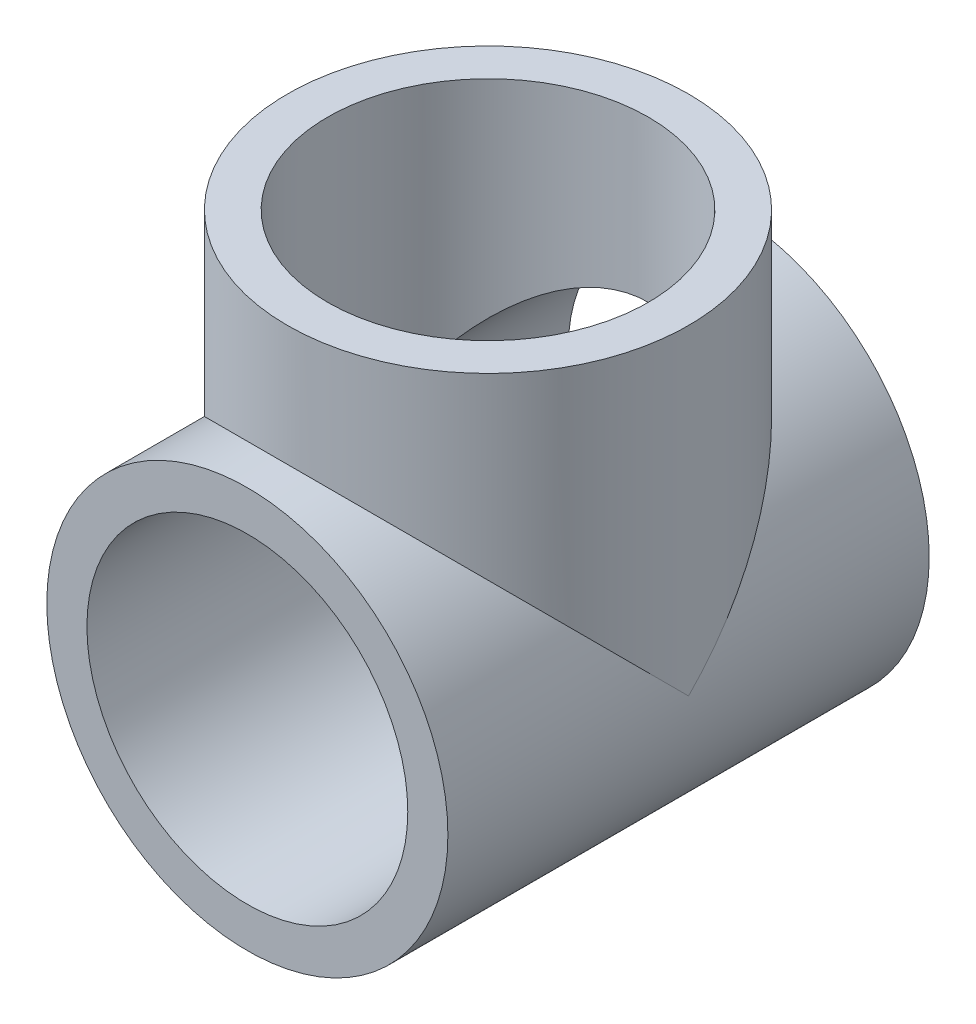
ISO-10303-21;
HEADER;
FILE_DESCRIPTION(('STEP AP214'),'2;1');
FILE_NAME('part.step','',(''),(''),'','','');
FILE_SCHEMA(('AUTOMOTIVE_DESIGN { 1 0 10303 214 1 1 1 1 }'));
ENDSEC;
DATA;
#1=APPLICATION_CONTEXT('core data for automotive mechanical design processes');
#2=APPLICATION_PROTOCOL_DEFINITION('international standard','automotive_design',2000,#1);
#3=PRODUCT_CONTEXT('',#1,'mechanical');
#4=PRODUCT('Part','Part','',(#3));
#5=PRODUCT_RELATED_PRODUCT_CATEGORY('part','',(#4));
#6=PRODUCT_DEFINITION_FORMATION('','',#4);
#7=PRODUCT_DEFINITION_CONTEXT('part definition',#1,'design');
#8=PRODUCT_DEFINITION('design','',#6,#7);
#9=PRODUCT_DEFINITION_SHAPE('','',#8);
#10=(LENGTH_UNIT() NAMED_UNIT(*) SI_UNIT(.MILLI.,.METRE.));
#11=(NAMED_UNIT(*) PLANE_ANGLE_UNIT() SI_UNIT($,.RADIAN.));
#12=(NAMED_UNIT(*) SI_UNIT($,.STERADIAN.) SOLID_ANGLE_UNIT());
#13=UNCERTAINTY_MEASURE_WITH_UNIT(LENGTH_MEASURE(1.E-05),#10,'distance_accuracy_value','');
#14=(GEOMETRIC_REPRESENTATION_CONTEXT(3) GLOBAL_UNCERTAINTY_ASSIGNED_CONTEXT((#13)) GLOBAL_UNIT_ASSIGNED_CONTEXT((#10,
#11,#12)) REPRESENTATION_CONTEXT('',''));
#15=CARTESIAN_POINT('',(0.,0.,0.));
#16=DIRECTION('',(0.,0.,1.));
#17=DIRECTION('',(1.,0.,0.));
#18=AXIS2_PLACEMENT_3D('',#15,#16,#17);
#19=CARTESIAN_POINT('',(0.,0.,15.));
#20=DIRECTION('',(0.,0.,1.));
#21=DIRECTION('',(1.,0.,0.));
#22=AXIS2_PLACEMENT_3D('',#19,#20,#21);
#23=PLANE('',#22);
#24=CARTESIAN_POINT('',(0.,0.,15.));
#25=DIRECTION('',(0.,0.,1.));
#26=DIRECTION('',(1.,0.,0.));
#27=AXIS2_PLACEMENT_3D('',#24,#25,#26);
#28=CIRCLE('',#27,12.5);
#29=CARTESIAN_POINT('',(12.5,0.,15.));
#30=VERTEX_POINT('',#29);
#31=EDGE_CURVE('E11',#30,#30,#28,.T.);
#32=ORIENTED_EDGE('',*,*,#31,.T.);
#33=EDGE_LOOP('',(#32));
#34=FACE_BOUND('',#33,.T.);
#35=CARTESIAN_POINT('',(0.,0.,15.));
#36=DIRECTION('',(0.,0.,1.));
#37=DIRECTION('',(1.,0.,0.));
#38=AXIS2_PLACEMENT_3D('',#35,#36,#37);
#39=CIRCLE('',#38,10.);
#40=CARTESIAN_POINT('',(10.,0.,15.));
#41=VERTEX_POINT('',#40);
#42=EDGE_CURVE('E90',#41,#41,#39,.T.);
#43=ORIENTED_EDGE('',*,*,#42,.F.);
#44=EDGE_LOOP('',(#43));
#45=FACE_BOUND('',#44,.T.);
#46=ADVANCED_FACE('F39',(#34,#45),#23,.T.);
#47=CARTESIAN_POINT('',(0.,0.,-15.));
#48=DIRECTION('',(0.,0.,1.));
#49=DIRECTION('',(1.,0.,0.));
#50=AXIS2_PLACEMENT_3D('',#47,#48,#49);
#51=PLANE('',#50);
#52=CARTESIAN_POINT('',(0.,0.,-15.));
#53=DIRECTION('',(0.,0.,1.));
#54=DIRECTION('',(1.,0.,0.));
#55=AXIS2_PLACEMENT_3D('',#52,#53,#54);
#56=CIRCLE('',#55,12.5);
#57=CARTESIAN_POINT('',(12.5,0.,-15.));
#58=VERTEX_POINT('',#57);
#59=EDGE_CURVE('E43',#58,#58,#56,.T.);
#60=ORIENTED_EDGE('',*,*,#59,.F.);
#61=EDGE_LOOP('',(#60));
#62=FACE_BOUND('',#61,.T.);
#63=CARTESIAN_POINT('',(0.,0.,-15.));
#64=DIRECTION('',(0.,0.,1.));
#65=DIRECTION('',(1.,0.,0.));
#66=AXIS2_PLACEMENT_3D('',#63,#64,#65);
#67=CIRCLE('',#66,10.);
#68=CARTESIAN_POINT('',(10.,0.,-15.));
#69=VERTEX_POINT('',#68);
#70=EDGE_CURVE('E84',#69,#69,#67,.T.);
#71=ORIENTED_EDGE('',*,*,#70,.T.);
#72=EDGE_LOOP('',(#71));
#73=FACE_BOUND('',#72,.T.);
#74=ADVANCED_FACE('F98',(#62,#73),#51,.F.);
#75=CARTESIAN_POINT('',(0.,0.,15.));
#76=DIRECTION('',(0.,0.,-1.));
#77=DIRECTION('',(-1.,0.,0.));
#78=AXIS2_PLACEMENT_3D('',#75,#76,#77);
#79=CYLINDRICAL_SURFACE('',#78,12.5);
#80=CARTESIAN_POINT('',(0.,0.,0.));
#81=DIRECTION('',(0.,0.707106781186547,0.707106781186547));
#82=DIRECTION('',(0.,0.707106781186547,-0.707106781186547));
#83=AXIS2_PLACEMENT_3D('',#80,#81,#82);
#84=ELLIPSE('',#83,17.6776695296637,12.5);
#85=CARTESIAN_POINT('',(12.5,0.,0.));
#86=VERTEX_POINT('',#85);
#87=CARTESIAN_POINT('',(-12.5,0.,0.));
#88=VERTEX_POINT('',#87);
#89=EDGE_CURVE('E81',#86,#88,#84,.T.);
#90=ORIENTED_EDGE('',*,*,#89,.F.);
#91=CARTESIAN_POINT('',(0.,0.,0.));
#92=DIRECTION('',(0.,0.707106781186547,-0.707106781186547));
#93=DIRECTION('',(0.,0.707106781186547,0.707106781186547));
#94=AXIS2_PLACEMENT_3D('',#91,#92,#93);
#95=ELLIPSE('',#94,17.6776695296637,12.5);
#96=EDGE_CURVE('E61',#88,#86,#95,.T.);
#97=ORIENTED_EDGE('',*,*,#96,.F.);
#98=EDGE_LOOP('',(#90,#97));
#99=FACE_BOUND('',#98,.T.);
#100=ORIENTED_EDGE('',*,*,#31,.F.);
#101=EDGE_LOOP('',(#100));
#102=FACE_BOUND('',#101,.T.);
#103=ORIENTED_EDGE('',*,*,#59,.T.);
#104=EDGE_LOOP('',(#103));
#105=FACE_BOUND('',#104,.T.);
#106=ADVANCED_FACE('F41',(#99,#102,#105),#79,.T.);
#107=CARTESIAN_POINT('',(0.,0.,15.));
#108=DIRECTION('',(0.,0.,-1.));
#109=DIRECTION('',(-1.,0.,0.));
#110=AXIS2_PLACEMENT_3D('',#107,#108,#109);
#111=CYLINDRICAL_SURFACE('',#110,10.);
#112=CARTESIAN_POINT('',(0.,0.,0.));
#113=DIRECTION('',(0.,0.707106781186547,-0.707106781186547));
#114=DIRECTION('',(0.,-0.707106781186547,-0.707106781186547));
#115=AXIS2_PLACEMENT_3D('',#112,#113,#114);
#116=ELLIPSE('',#115,14.1421356237309,10.);
#117=CARTESIAN_POINT('',(10.,0.,0.));
#118=VERTEX_POINT('',#117);
#119=CARTESIAN_POINT('',(-10.,0.,0.));
#120=VERTEX_POINT('',#119);
#121=EDGE_CURVE('E54',#118,#120,#116,.F.);
#122=ORIENTED_EDGE('',*,*,#121,.F.);
#123=CARTESIAN_POINT('',(0.,0.,0.));
#124=DIRECTION('',(0.,-0.707106781186547,-0.707106781186547));
#125=DIRECTION('',(0.,0.707106781186547,-0.707106781186547));
#126=AXIS2_PLACEMENT_3D('',#123,#124,#125);
#127=ELLIPSE('',#126,14.1421356237309,10.);
#128=EDGE_CURVE('E66',#120,#118,#127,.T.);
#129=ORIENTED_EDGE('',*,*,#128,.F.);
#130=EDGE_LOOP('',(#122,#129));
#131=FACE_BOUND('',#130,.T.);
#132=ORIENTED_EDGE('',*,*,#42,.T.);
#133=EDGE_LOOP('',(#132));
#134=FACE_BOUND('',#133,.T.);
#135=ORIENTED_EDGE('',*,*,#70,.F.);
#136=EDGE_LOOP('',(#135));
#137=FACE_BOUND('',#136,.T.);
#138=ADVANCED_FACE('F71',(#131,#134,#137),#111,.F.);
#139=CARTESIAN_POINT('',(0.,-12.501,0.));
#140=DIRECTION('',(0.,1.,0.));
#141=DIRECTION('',(0.,0.,1.));
#142=AXIS2_PLACEMENT_3D('',#139,#140,#141);
#143=CYLINDRICAL_SURFACE('',#142,12.5);
#144=CARTESIAN_POINT('',(0.,20.,0.));
#145=DIRECTION('',(0.,1.,0.));
#146=DIRECTION('',(0.,0.,1.));
#147=AXIS2_PLACEMENT_3D('',#144,#145,#146);
#148=CIRCLE('',#147,12.5);
#149=CARTESIAN_POINT('',(0.,20.,12.5));
#150=VERTEX_POINT('',#149);
#151=EDGE_CURVE('E78',#150,#150,#148,.T.);
#152=ORIENTED_EDGE('',*,*,#151,.F.);
#153=EDGE_LOOP('',(#152));
#154=FACE_BOUND('',#153,.T.);
#155=ORIENTED_EDGE('',*,*,#89,.T.);
#156=ORIENTED_EDGE('',*,*,#96,.T.);
#157=EDGE_LOOP('',(#155,#156));
#158=FACE_BOUND('',#157,.T.);
#159=ADVANCED_FACE('F101',(#154,#158),#143,.T.);
#160=CARTESIAN_POINT('',(0.,20.,0.));
#161=DIRECTION('',(0.,1.,0.));
#162=DIRECTION('',(0.,0.,1.));
#163=AXIS2_PLACEMENT_3D('',#160,#161,#162);
#164=PLANE('',#163);
#165=CARTESIAN_POINT('',(0.,20.,0.));
#166=DIRECTION('',(0.,1.,0.));
#167=DIRECTION('',(0.,0.,1.));
#168=AXIS2_PLACEMENT_3D('',#165,#166,#167);
#169=CIRCLE('',#168,10.);
#170=CARTESIAN_POINT('',(0.,20.,10.));
#171=VERTEX_POINT('',#170);
#172=EDGE_CURVE('E74',#171,#171,#169,.T.);
#173=ORIENTED_EDGE('',*,*,#172,.F.);
#174=EDGE_LOOP('',(#173));
#175=FACE_BOUND('',#174,.T.);
#176=ORIENTED_EDGE('',*,*,#151,.T.);
#177=EDGE_LOOP('',(#176));
#178=FACE_BOUND('',#177,.T.);
#179=ADVANCED_FACE('F107',(#175,#178),#164,.T.);
#180=CARTESIAN_POINT('',(0.,-12.501,0.));
#181=DIRECTION('',(0.,1.,0.));
#182=DIRECTION('',(0.,0.,1.));
#183=AXIS2_PLACEMENT_3D('',#180,#181,#182);
#184=CYLINDRICAL_SURFACE('',#183,10.);
#185=ORIENTED_EDGE('',*,*,#172,.T.);
#186=EDGE_LOOP('',(#185));
#187=FACE_BOUND('',#186,.T.);
#188=ORIENTED_EDGE('',*,*,#121,.T.);
#189=ORIENTED_EDGE('',*,*,#128,.T.);
#190=EDGE_LOOP('',(#188,#189));
#191=FACE_BOUND('',#190,.T.);
#192=ADVANCED_FACE('F67',(#187,#191),#184,.F.);
#193=CLOSED_SHELL('',(#46,#74,#106,#138,#159,#179,#192));
#194=MANIFOLD_SOLID_BREP('B2',#193);
#195=ADVANCED_BREP_SHAPE_REPRESENTATION('',(#18,#194),#14);
#196=SHAPE_DEFINITION_REPRESENTATION(#9,#195);
ENDSEC;
END-ISO-10303-21;
